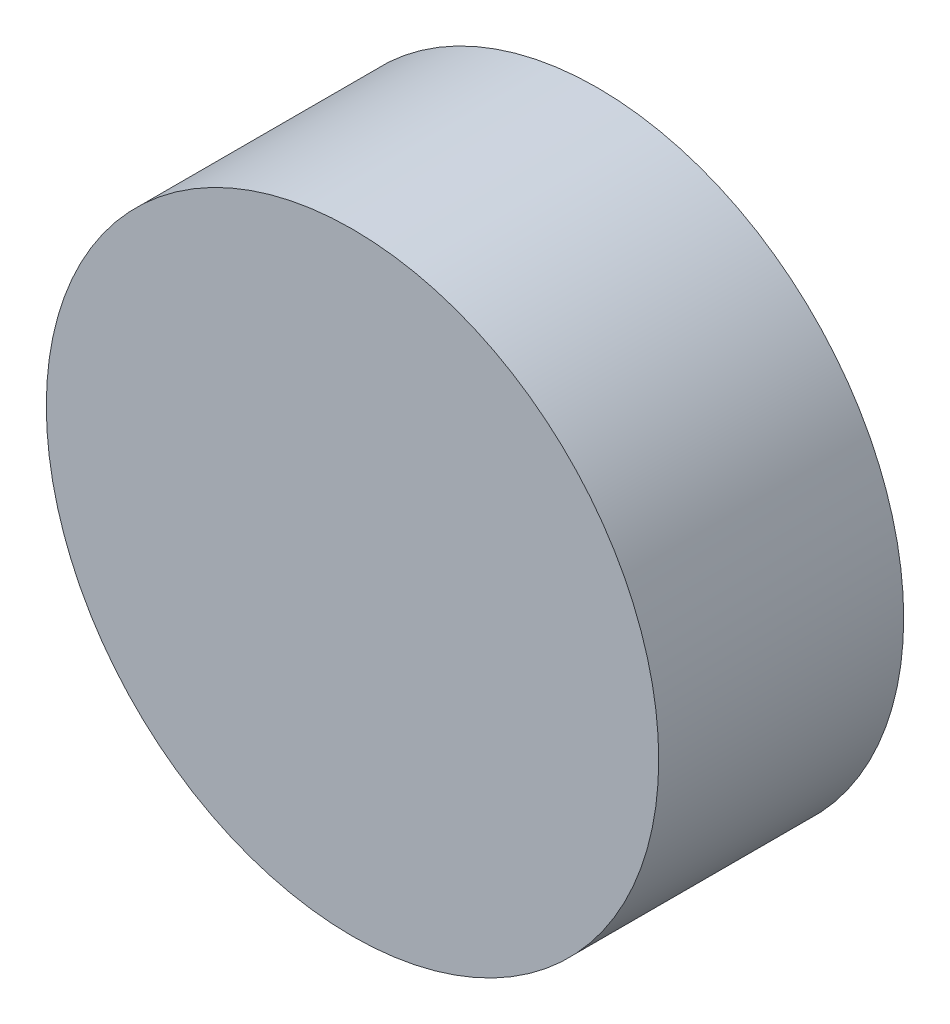
ISO-10303-21;
HEADER;
FILE_DESCRIPTION(('STEP AP214'),'2;1');
FILE_NAME('part.step','',(''),(''),'','','');
FILE_SCHEMA(('AUTOMOTIVE_DESIGN { 1 0 10303 214 1 1 1 1 }'));
ENDSEC;
DATA;
#1=APPLICATION_CONTEXT('core data for automotive mechanical design processes');
#2=APPLICATION_PROTOCOL_DEFINITION('international standard','automotive_design',2000,#1);
#3=PRODUCT_CONTEXT('',#1,'mechanical');
#4=PRODUCT('Part','Part','',(#3));
#5=PRODUCT_RELATED_PRODUCT_CATEGORY('part','',(#4));
#6=PRODUCT_DEFINITION_FORMATION('','',#4);
#7=PRODUCT_DEFINITION_CONTEXT('part definition',#1,'design');
#8=PRODUCT_DEFINITION('design','',#6,#7);
#9=PRODUCT_DEFINITION_SHAPE('','',#8);
#10=(LENGTH_UNIT() NAMED_UNIT(*) SI_UNIT(.MILLI.,.METRE.));
#11=(NAMED_UNIT(*) PLANE_ANGLE_UNIT() SI_UNIT($,.RADIAN.));
#12=(NAMED_UNIT(*) SI_UNIT($,.STERADIAN.) SOLID_ANGLE_UNIT());
#13=UNCERTAINTY_MEASURE_WITH_UNIT(LENGTH_MEASURE(1.E-05),#10,'distance_accuracy_value','');
#14=(GEOMETRIC_REPRESENTATION_CONTEXT(3) GLOBAL_UNCERTAINTY_ASSIGNED_CONTEXT((#13)) GLOBAL_UNIT_ASSIGNED_CONTEXT((#10,
#11,#12)) REPRESENTATION_CONTEXT('',''));
#15=CARTESIAN_POINT('',(0.,0.,0.));
#16=DIRECTION('',(0.,0.,1.));
#17=DIRECTION('',(1.,0.,0.));
#18=AXIS2_PLACEMENT_3D('',#15,#16,#17);
#19=CARTESIAN_POINT('',(0.,0.,2.032));
#20=DIRECTION('',(0.,0.,-1.));
#21=DIRECTION('',(-1.,0.,0.));
#22=AXIS2_PLACEMENT_3D('',#19,#20,#21);
#23=CYLINDRICAL_SURFACE('',#22,2.54);
#24=CARTESIAN_POINT('',(0.,0.,2.032));
#25=DIRECTION('',(0.,0.,1.));
#26=DIRECTION('',(1.,0.,0.));
#27=AXIS2_PLACEMENT_3D('',#24,#25,#26);
#28=CIRCLE('',#27,2.54);
#29=CARTESIAN_POINT('',(2.54,0.,2.032));
#30=VERTEX_POINT('',#29);
#31=EDGE_CURVE('E10',#30,#30,#28,.T.);
#32=ORIENTED_EDGE('',*,*,#31,.F.);
#33=EDGE_LOOP('',(#32));
#34=FACE_BOUND('',#33,.T.);
#35=CARTESIAN_POINT('',(0.,0.,0.));
#36=DIRECTION('',(0.,0.,1.));
#37=DIRECTION('',(1.,0.,0.));
#38=AXIS2_PLACEMENT_3D('',#35,#36,#37);
#39=CIRCLE('',#38,2.54);
#40=CARTESIAN_POINT('',(2.54,0.,0.));
#41=VERTEX_POINT('',#40);
#42=EDGE_CURVE('E35',#41,#41,#39,.T.);
#43=ORIENTED_EDGE('',*,*,#42,.T.);
#44=EDGE_LOOP('',(#43));
#45=FACE_BOUND('',#44,.T.);
#46=ADVANCED_FACE('F32',(#34,#45),#23,.T.);
#47=CARTESIAN_POINT('',(0.,0.,2.032));
#48=DIRECTION('',(0.,0.,1.));
#49=DIRECTION('',(1.,0.,0.));
#50=AXIS2_PLACEMENT_3D('',#47,#48,#49);
#51=PLANE('',#50);
#52=ORIENTED_EDGE('',*,*,#31,.T.);
#53=EDGE_LOOP('',(#52));
#54=FACE_BOUND('',#53,.T.);
#55=ADVANCED_FACE('F47',(#54),#51,.T.);
#56=CARTESIAN_POINT('',(0.,0.,0.));
#57=DIRECTION('',(0.,0.,1.));
#58=DIRECTION('',(1.,0.,0.));
#59=AXIS2_PLACEMENT_3D('',#56,#57,#58);
#60=PLANE('',#59);
#61=ORIENTED_EDGE('',*,*,#42,.F.);
#62=EDGE_LOOP('',(#61));
#63=FACE_BOUND('',#62,.T.);
#64=ADVANCED_FACE('F45',(#63),#60,.F.);
#65=CLOSED_SHELL('',(#46,#55,#64));
#66=MANIFOLD_SOLID_BREP('B2',#65);
#67=ADVANCED_BREP_SHAPE_REPRESENTATION('',(#18,#66),#14);
#68=SHAPE_DEFINITION_REPRESENTATION(#9,#67);
ENDSEC;
END-ISO-10303-21;
